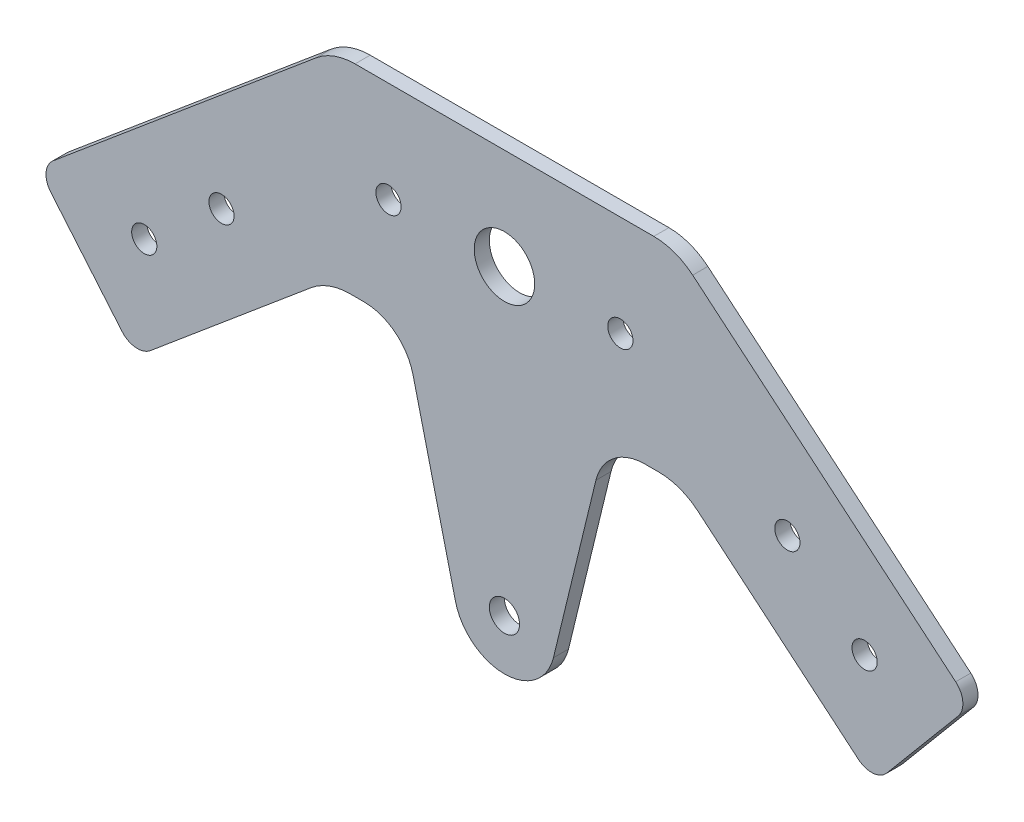
ISO-10303-21;
HEADER;
FILE_DESCRIPTION(('STEP AP214'),'2;1');
FILE_NAME('part.step','',(''),(''),'','','');
FILE_SCHEMA(('AUTOMOTIVE_DESIGN { 1 0 10303 214 1 1 1 1 }'));
ENDSEC;
DATA;
#1=APPLICATION_CONTEXT('core data for automotive mechanical design processes');
#2=APPLICATION_PROTOCOL_DEFINITION('international standard','automotive_design',2000,#1);
#3=PRODUCT_CONTEXT('',#1,'mechanical');
#4=PRODUCT('Part','Part','',(#3));
#5=PRODUCT_RELATED_PRODUCT_CATEGORY('part','',(#4));
#6=PRODUCT_DEFINITION_FORMATION('','',#4);
#7=PRODUCT_DEFINITION_CONTEXT('part definition',#1,'design');
#8=PRODUCT_DEFINITION('design','',#6,#7);
#9=PRODUCT_DEFINITION_SHAPE('','',#8);
#10=(LENGTH_UNIT() NAMED_UNIT(*) SI_UNIT(.MILLI.,.METRE.));
#11=(NAMED_UNIT(*) PLANE_ANGLE_UNIT() SI_UNIT($,.RADIAN.));
#12=(NAMED_UNIT(*) SI_UNIT($,.STERADIAN.) SOLID_ANGLE_UNIT());
#13=UNCERTAINTY_MEASURE_WITH_UNIT(LENGTH_MEASURE(1.E-05),#10,'distance_accuracy_value','');
#14=(GEOMETRIC_REPRESENTATION_CONTEXT(3) GLOBAL_UNCERTAINTY_ASSIGNED_CONTEXT((#13)) GLOBAL_UNIT_ASSIGNED_CONTEXT((#10,
#11,#12)) REPRESENTATION_CONTEXT('',''));
#15=CARTESIAN_POINT('',(0.,0.,0.));
#16=DIRECTION('',(0.,0.,1.));
#17=DIRECTION('',(1.,0.,0.));
#18=AXIS2_PLACEMENT_3D('',#15,#16,#17);
#19=CARTESIAN_POINT('',(27.862996478469,-9.99999999999998,-3.));
#20=DIRECTION('',(0.,0.,1.));
#21=DIRECTION('',(1.,0.,0.));
#22=AXIS2_PLACEMENT_3D('',#19,#20,#21);
#23=CYLINDRICAL_SURFACE('',#22,10.);
#24=CARTESIAN_POINT('',(27.862996478469,-9.99999999999998,0.));
#25=DIRECTION('',(0.,0.,-1.));
#26=DIRECTION('',(1.,0.,0.));
#27=AXIS2_PLACEMENT_3D('',#24,#25,#26);
#28=CIRCLE('',#27,10.);
#29=CARTESIAN_POINT('',(18.1451985913876,-7.64110105645935,0.));
#30=VERTEX_POINT('',#29);
#31=CARTESIAN_POINT('',(27.862996478469,0.,0.));
#32=VERTEX_POINT('',#31);
#33=EDGE_CURVE('E221',#30,#32,#28,.T.);
#34=ORIENTED_EDGE('',*,*,#33,.F.);
#35=DIRECTION('',(0.,0.,1.));
#36=VECTOR('',#35,1.);
#37=CARTESIAN_POINT('',(18.1451985913876,-7.64110105645935,-3.));
#38=LINE('',#37,#36);
#39=CARTESIAN_POINT('',(18.1451985913876,-7.64110105645935,-3.));
#40=VERTEX_POINT('',#39);
#41=EDGE_CURVE('E12',#40,#30,#38,.T.);
#42=ORIENTED_EDGE('',*,*,#41,.F.);
#43=CARTESIAN_POINT('',(27.862996478469,-9.99999999999998,-3.));
#44=DIRECTION('',(0.,0.,-1.));
#45=DIRECTION('',(1.,0.,0.));
#46=AXIS2_PLACEMENT_3D('',#43,#44,#45);
#47=CIRCLE('',#46,10.);
#48=CARTESIAN_POINT('',(27.862996478469,0.,-3.));
#49=VERTEX_POINT('',#48);
#50=EDGE_CURVE('E340',#40,#49,#47,.T.);
#51=ORIENTED_EDGE('',*,*,#50,.T.);
#52=DIRECTION('',(0.,0.,1.));
#53=VECTOR('',#52,1.);
#54=CARTESIAN_POINT('',(27.862996478469,0.,-3.));
#55=LINE('',#54,#53);
#56=EDGE_CURVE('E43',#49,#32,#55,.T.);
#57=ORIENTED_EDGE('',*,*,#56,.T.);
#58=EDGE_LOOP('',(#34,#42,#51,#57));
#59=FACE_BOUND('',#58,.T.);
#60=ADVANCED_FACE('F40',(#59),#23,.F.);
#61=CARTESIAN_POINT('',(18.1451985913876,-7.64110105645935,-3.));
#62=DIRECTION('',(0.971779788708134,-0.235889894354069,0.));
#63=DIRECTION('',(0.235889894354069,0.971779788708135,0.));
#64=AXIS2_PLACEMENT_3D('',#61,#62,#63);
#65=PLANE('',#64);
#66=DIRECTION('',(0.235889894354069,0.971779788708135,0.));
#67=VECTOR('',#66,1.);
#68=CARTESIAN_POINT('',(18.1451985913876,-7.64110105645935,0.));
#69=LINE('',#68,#67);
#70=CARTESIAN_POINT('',(9.71779788708135,-42.3588989435407,0.));
#71=VERTEX_POINT('',#70);
#72=EDGE_CURVE('E336',#71,#30,#69,.T.);
#73=ORIENTED_EDGE('',*,*,#72,.F.);
#74=DIRECTION('',(0.,0.,1.));
#75=VECTOR('',#74,1.);
#76=CARTESIAN_POINT('',(9.71779788708135,-42.3588989435407,-3.));
#77=LINE('',#76,#75);
#78=CARTESIAN_POINT('',(9.71779788708135,-42.3588989435407,-3.));
#79=VERTEX_POINT('',#78);
#80=EDGE_CURVE('E49',#79,#71,#77,.T.);
#81=ORIENTED_EDGE('',*,*,#80,.F.);
#82=DIRECTION('',(0.235889894354069,0.971779788708135,0.));
#83=VECTOR('',#82,1.);
#84=CARTESIAN_POINT('',(18.1451985913876,-7.64110105645935,-3.));
#85=LINE('',#84,#83);
#86=EDGE_CURVE('E211',#79,#40,#85,.T.);
#87=ORIENTED_EDGE('',*,*,#86,.T.);
#88=ORIENTED_EDGE('',*,*,#41,.T.);
#89=EDGE_LOOP('',(#73,#81,#87,#88));
#90=FACE_BOUND('',#89,.T.);
#91=ADVANCED_FACE('F383',(#90),#65,.T.);
#92=CARTESIAN_POINT('',(0.,-40.,-3.));
#93=DIRECTION('',(0.,0.,1.));
#94=DIRECTION('',(1.,0.,0.));
#95=AXIS2_PLACEMENT_3D('',#92,#93,#94);
#96=CYLINDRICAL_SURFACE('',#95,10.);
#97=CARTESIAN_POINT('',(0.,-40.,0.));
#98=DIRECTION('',(0.,0.,1.));
#99=DIRECTION('',(1.,0.,0.));
#100=AXIS2_PLACEMENT_3D('',#97,#98,#99);
#101=CIRCLE('',#100,10.);
#102=CARTESIAN_POINT('',(-9.71779788708135,-42.3588989435407,0.));
#103=VERTEX_POINT('',#102);
#104=EDGE_CURVE('E198',#103,#71,#101,.T.);
#105=ORIENTED_EDGE('',*,*,#104,.F.);
#106=DIRECTION('',(0.,0.,1.));
#107=VECTOR('',#106,1.);
#108=CARTESIAN_POINT('',(-9.71779788708135,-42.3588989435407,-3.));
#109=LINE('',#108,#107);
#110=CARTESIAN_POINT('',(-9.71779788708135,-42.3588989435407,-3.));
#111=VERTEX_POINT('',#110);
#112=EDGE_CURVE('E193',#111,#103,#109,.T.);
#113=ORIENTED_EDGE('',*,*,#112,.F.);
#114=CARTESIAN_POINT('',(0.,-40.,-3.));
#115=DIRECTION('',(0.,0.,1.));
#116=DIRECTION('',(1.,0.,0.));
#117=AXIS2_PLACEMENT_3D('',#114,#115,#116);
#118=CIRCLE('',#117,10.);
#119=EDGE_CURVE('E196',#111,#79,#118,.T.);
#120=ORIENTED_EDGE('',*,*,#119,.T.);
#121=ORIENTED_EDGE('',*,*,#80,.T.);
#122=EDGE_LOOP('',(#105,#113,#120,#121));
#123=FACE_BOUND('',#122,.T.);
#124=ADVANCED_FACE('F195',(#123),#96,.T.);
#125=CARTESIAN_POINT('',(-18.1451985913876,-7.64110105645937,-3.));
#126=DIRECTION('',(-0.971779788708135,-0.235889894354068,0.));
#127=DIRECTION('',(0.235889894354068,-0.971779788708135,0.));
#128=AXIS2_PLACEMENT_3D('',#125,#126,#127);
#129=PLANE('',#128);
#130=DIRECTION('',(0.235889894354068,-0.971779788708135,0.));
#131=VECTOR('',#130,1.);
#132=CARTESIAN_POINT('',(-18.1451985913876,-7.64110105645937,0.));
#133=LINE('',#132,#131);
#134=CARTESIAN_POINT('',(-18.1451985913876,-7.64110105645937,0.));
#135=VERTEX_POINT('',#134);
#136=EDGE_CURVE('E330',#135,#103,#133,.T.);
#137=ORIENTED_EDGE('',*,*,#136,.F.);
#138=DIRECTION('',(0.,0.,1.));
#139=VECTOR('',#138,1.);
#140=CARTESIAN_POINT('',(-18.1451985913876,-7.64110105645937,-3.));
#141=LINE('',#140,#139);
#142=CARTESIAN_POINT('',(-18.1451985913876,-7.64110105645937,-3.));
#143=VERTEX_POINT('',#142);
#144=EDGE_CURVE('E203',#143,#135,#141,.T.);
#145=ORIENTED_EDGE('',*,*,#144,.F.);
#146=DIRECTION('',(0.235889894354068,-0.971779788708135,0.));
#147=VECTOR('',#146,1.);
#148=CARTESIAN_POINT('',(-18.1451985913876,-7.64110105645937,-3.));
#149=LINE('',#148,#147);
#150=EDGE_CURVE('E209',#143,#111,#149,.T.);
#151=ORIENTED_EDGE('',*,*,#150,.T.);
#152=ORIENTED_EDGE('',*,*,#112,.T.);
#153=EDGE_LOOP('',(#137,#145,#151,#152));
#154=FACE_BOUND('',#153,.T.);
#155=ADVANCED_FACE('F213',(#154),#129,.T.);
#156=CARTESIAN_POINT('',(-27.862996478469,-10.,-3.));
#157=DIRECTION('',(0.,0.,1.));
#158=DIRECTION('',(1.,0.,0.));
#159=AXIS2_PLACEMENT_3D('',#156,#157,#158);
#160=CYLINDRICAL_SURFACE('',#159,10.);
#161=CARTESIAN_POINT('',(-27.862996478469,-10.,0.));
#162=DIRECTION('',(0.,0.,-1.));
#163=DIRECTION('',(1.,0.,0.));
#164=AXIS2_PLACEMENT_3D('',#161,#162,#163);
#165=CIRCLE('',#164,10.);
#166=CARTESIAN_POINT('',(-27.862996478469,0.,0.));
#167=VERTEX_POINT('',#166);
#168=EDGE_CURVE('E326',#167,#135,#165,.T.);
#169=ORIENTED_EDGE('',*,*,#168,.F.);
#170=DIRECTION('',(0.,0.,1.));
#171=VECTOR('',#170,1.);
#172=CARTESIAN_POINT('',(-27.862996478469,0.,-3.));
#173=LINE('',#172,#171);
#174=CARTESIAN_POINT('',(-27.862996478469,0.,-3.));
#175=VERTEX_POINT('',#174);
#176=EDGE_CURVE('E344',#175,#167,#173,.T.);
#177=ORIENTED_EDGE('',*,*,#176,.F.);
#178=CARTESIAN_POINT('',(-27.862996478469,-10.,-3.));
#179=DIRECTION('',(0.,0.,-1.));
#180=DIRECTION('',(1.,0.,0.));
#181=AXIS2_PLACEMENT_3D('',#178,#179,#180);
#182=CIRCLE('',#181,10.);
#183=EDGE_CURVE('E214',#175,#143,#182,.T.);
#184=ORIENTED_EDGE('',*,*,#183,.T.);
#185=ORIENTED_EDGE('',*,*,#144,.T.);
#186=EDGE_LOOP('',(#169,#177,#184,#185));
#187=FACE_BOUND('',#186,.T.);
#188=ADVANCED_FACE('F396',(#187),#160,.F.);
#189=CARTESIAN_POINT('',(-30.6323571888055,0.,-3.));
#190=DIRECTION('',(0.,-1.,0.));
#191=DIRECTION('',(1.,0.,0.));
#192=AXIS2_PLACEMENT_3D('',#189,#190,#191);
#193=PLANE('',#192);
#194=DIRECTION('',(1.,0.,0.));
#195=VECTOR('',#194,1.);
#196=CARTESIAN_POINT('',(-30.6323571888055,0.,0.));
#197=LINE('',#196,#195);
#198=CARTESIAN_POINT('',(-30.6323571888055,0.,0.));
#199=VERTEX_POINT('',#198);
#200=EDGE_CURVE('E319',#199,#167,#197,.T.);
#201=ORIENTED_EDGE('',*,*,#200,.F.);
#202=DIRECTION('',(0.,0.,1.));
#203=VECTOR('',#202,1.);
#204=CARTESIAN_POINT('',(-30.6323571888055,0.,-3.));
#205=LINE('',#204,#203);
#206=CARTESIAN_POINT('',(-30.6323571888055,0.,-3.));
#207=VERTEX_POINT('',#206);
#208=EDGE_CURVE('E346',#207,#199,#205,.T.);
#209=ORIENTED_EDGE('',*,*,#208,.F.);
#210=DIRECTION('',(1.,0.,0.));
#211=VECTOR('',#210,1.);
#212=CARTESIAN_POINT('',(-30.6323571888055,0.,-3.));
#213=LINE('',#212,#211);
#214=EDGE_CURVE('E216',#207,#175,#213,.T.);
#215=ORIENTED_EDGE('',*,*,#214,.T.);
#216=ORIENTED_EDGE('',*,*,#176,.T.);
#217=EDGE_LOOP('',(#201,#209,#215,#216));
#218=FACE_BOUND('',#217,.T.);
#219=ADVANCED_FACE('F399',(#218),#193,.T.);
#220=CARTESIAN_POINT('',(-30.6323571888055,-12.,-3.));
#221=DIRECTION('',(0.,0.,1.));
#222=DIRECTION('',(1.,0.,0.));
#223=AXIS2_PLACEMENT_3D('',#220,#221,#222);
#224=CYLINDRICAL_SURFACE('',#223,12.);
#225=CARTESIAN_POINT('',(-30.6323571888055,-12.,0.));
#226=DIRECTION('',(0.,0.,-1.));
#227=DIRECTION('',(1.,0.,0.));
#228=AXIS2_PLACEMENT_3D('',#225,#226,#227);
#229=CIRCLE('',#228,12.);
#230=CARTESIAN_POINT('',(-38.345808505044,-2.80746668257224,0.));
#231=VERTEX_POINT('',#230);
#232=EDGE_CURVE('E314',#231,#199,#229,.T.);
#233=ORIENTED_EDGE('',*,*,#232,.F.);
#234=DIRECTION('',(0.,0.,1.));
#235=VECTOR('',#234,1.);
#236=CARTESIAN_POINT('',(-38.345808505044,-2.80746668257224,-3.));
#237=LINE('',#236,#235);
#238=CARTESIAN_POINT('',(-38.345808505044,-2.80746668257224,-3.));
#239=VERTEX_POINT('',#238);
#240=EDGE_CURVE('E348',#239,#231,#237,.T.);
#241=ORIENTED_EDGE('',*,*,#240,.F.);
#242=CARTESIAN_POINT('',(-30.6323571888055,-12.,-3.));
#243=DIRECTION('',(0.,0.,-1.));
#244=DIRECTION('',(1.,0.,0.));
#245=AXIS2_PLACEMENT_3D('',#242,#243,#244);
#246=CIRCLE('',#245,12.);
#247=EDGE_CURVE('E621',#239,#207,#246,.T.);
#248=ORIENTED_EDGE('',*,*,#247,.T.);
#249=ORIENTED_EDGE('',*,*,#208,.T.);
#250=EDGE_LOOP('',(#233,#241,#248,#249));
#251=FACE_BOUND('',#250,.T.);
#252=ADVANCED_FACE('F403',(#251),#224,.F.);
#253=CARTESIAN_POINT('',(-38.345808505044,-2.80746668257224,-3.));
#254=DIRECTION('',(0.642787609686538,-0.766044443118979,0.));
#255=DIRECTION('',(0.766044443118979,0.642787609686538,0.));
#256=AXIS2_PLACEMENT_3D('',#253,#254,#255);
#257=PLANE('',#256);
#258=DIRECTION('',(0.766044443118979,0.642787609686538,0.));
#259=VECTOR('',#258,1.);
#260=CARTESIAN_POINT('',(-38.345808505044,-2.80746668257224,0.));
#261=LINE('',#260,#259);
#262=CARTESIAN_POINT('',(-70.238044383473,-29.5682300455807,0.));
#263=VERTEX_POINT('',#262);
#264=EDGE_CURVE('E309',#263,#231,#261,.T.);
#265=ORIENTED_EDGE('',*,*,#264,.F.);
#266=DIRECTION('',(0.,0.,1.));
#267=VECTOR('',#266,1.);
#268=CARTESIAN_POINT('',(-70.238044383473,-29.5682300455807,-3.));
#269=LINE('',#268,#267);
#270=CARTESIAN_POINT('',(-70.238044383473,-29.5682300455807,-3.));
#271=VERTEX_POINT('',#270);
#272=EDGE_CURVE('E350',#271,#263,#269,.T.);
#273=ORIENTED_EDGE('',*,*,#272,.F.);
#274=DIRECTION('',(0.766044443118979,0.642787609686538,0.));
#275=VECTOR('',#274,1.);
#276=CARTESIAN_POINT('',(-38.345808505044,-2.80746668257224,-3.));
#277=LINE('',#276,#275);
#278=EDGE_CURVE('E618',#271,#239,#277,.T.);
#279=ORIENTED_EDGE('',*,*,#278,.T.);
#280=ORIENTED_EDGE('',*,*,#240,.T.);
#281=EDGE_LOOP('',(#265,#273,#279,#280));
#282=FACE_BOUND('',#281,.T.);
#283=ADVANCED_FACE('F407',(#282),#257,.T.);
#284=CARTESIAN_POINT('',(-72.8091948222192,-26.5040522731048,-3.));
#285=DIRECTION('',(0.,0.,1.));
#286=DIRECTION('',(1.,0.,0.));
#287=AXIS2_PLACEMENT_3D('',#284,#285,#286);
#288=CYLINDRICAL_SURFACE('',#287,4.);
#289=CARTESIAN_POINT('',(-72.8091948222192,-26.5040522731048,0.));
#290=DIRECTION('',(0.,0.,1.));
#291=DIRECTION('',(-1.,0.,0.));
#292=AXIS2_PLACEMENT_3D('',#289,#290,#291);
#293=CIRCLE('',#292,4.);
#294=CARTESIAN_POINT('',(-75.8733725946951,-29.075202711851,0.));
#295=VERTEX_POINT('',#294);
#296=EDGE_CURVE('E305',#295,#263,#293,.T.);
#297=ORIENTED_EDGE('',*,*,#296,.F.);
#298=DIRECTION('',(0.,0.,1.));
#299=VECTOR('',#298,1.);
#300=CARTESIAN_POINT('',(-75.8733725946951,-29.075202711851,-3.));
#301=LINE('',#300,#299);
#302=CARTESIAN_POINT('',(-75.8733725946951,-29.075202711851,-3.));
#303=VERTEX_POINT('',#302);
#304=EDGE_CURVE('E352',#303,#295,#301,.T.);
#305=ORIENTED_EDGE('',*,*,#304,.F.);
#306=CARTESIAN_POINT('',(-72.8091948222192,-26.5040522731048,-3.));
#307=DIRECTION('',(0.,0.,1.));
#308=DIRECTION('',(-1.,0.,0.));
#309=AXIS2_PLACEMENT_3D('',#306,#307,#308);
#310=CIRCLE('',#309,4.);
#311=EDGE_CURVE('E615',#303,#271,#310,.T.);
#312=ORIENTED_EDGE('',*,*,#311,.T.);
#313=ORIENTED_EDGE('',*,*,#272,.T.);
#314=EDGE_LOOP('',(#297,#305,#312,#313));
#315=FACE_BOUND('',#314,.T.);
#316=ADVANCED_FACE('F411',(#315),#288,.T.);
#317=CARTESIAN_POINT('',(-75.8733725946951,-29.075202711851,-3.));
#318=DIRECTION('',(-0.766044443118979,-0.642787609686538,0.));
#319=DIRECTION('',(0.642787609686538,-0.766044443118979,0.));
#320=AXIS2_PLACEMENT_3D('',#317,#318,#319);
#321=PLANE('',#320);
#322=DIRECTION('',(0.642787609686538,-0.766044443118979,0.));
#323=VECTOR('',#322,1.);
#324=CARTESIAN_POINT('',(-75.8733725946951,-29.075202711851,0.));
#325=LINE('',#324,#323);
#326=CARTESIAN_POINT('',(-90.0147000077989,-12.2222249632334,0.));
#327=VERTEX_POINT('',#326);
#328=EDGE_CURVE('E297',#327,#295,#325,.T.);
#329=ORIENTED_EDGE('',*,*,#328,.F.);
#330=DIRECTION('',(0.,0.,1.));
#331=VECTOR('',#330,1.);
#332=CARTESIAN_POINT('',(-90.0147000077989,-12.2222249632334,-3.));
#333=LINE('',#332,#331);
#334=CARTESIAN_POINT('',(-90.0147000077989,-12.2222249632334,-3.));
#335=VERTEX_POINT('',#334);
#336=EDGE_CURVE('E354',#335,#327,#333,.T.);
#337=ORIENTED_EDGE('',*,*,#336,.F.);
#338=DIRECTION('',(0.642787609686538,-0.766044443118979,0.));
#339=VECTOR('',#338,1.);
#340=CARTESIAN_POINT('',(-75.8733725946951,-29.075202711851,-3.));
#341=LINE('',#340,#339);
#342=EDGE_CURVE('E612',#335,#303,#341,.T.);
#343=ORIENTED_EDGE('',*,*,#342,.T.);
#344=ORIENTED_EDGE('',*,*,#304,.T.);
#345=EDGE_LOOP('',(#329,#337,#343,#344));
#346=FACE_BOUND('',#345,.T.);
#347=ADVANCED_FACE('F415',(#346),#321,.T.);
#348=CARTESIAN_POINT('',(-86.950522235323,-9.65107452448727,-3.));
#349=DIRECTION('',(0.,0.,1.));
#350=DIRECTION('',(1.,0.,0.));
#351=AXIS2_PLACEMENT_3D('',#348,#349,#350);
#352=CYLINDRICAL_SURFACE('',#351,3.99999999999999);
#353=CARTESIAN_POINT('',(-86.950522235323,-9.65107452448727,0.));
#354=DIRECTION('',(0.,0.,1.));
#355=DIRECTION('',(1.,0.,0.));
#356=AXIS2_PLACEMENT_3D('',#353,#354,#355);
#357=CIRCLE('',#356,3.99999999999999);
#358=CARTESIAN_POINT('',(-89.5216726740692,-6.58689675201136,0.));
#359=VERTEX_POINT('',#358);
#360=EDGE_CURVE('E292',#359,#327,#357,.T.);
#361=ORIENTED_EDGE('',*,*,#360,.F.);
#362=DIRECTION('',(0.,0.,1.));
#363=VECTOR('',#362,1.);
#364=CARTESIAN_POINT('',(-89.5216726740692,-6.58689675201136,-3.));
#365=LINE('',#364,#363);
#366=CARTESIAN_POINT('',(-89.5216726740692,-6.58689675201136,-3.));
#367=VERTEX_POINT('',#366);
#368=EDGE_CURVE('E356',#367,#359,#365,.T.);
#369=ORIENTED_EDGE('',*,*,#368,.F.);
#370=CARTESIAN_POINT('',(-86.950522235323,-9.65107452448727,-3.));
#371=DIRECTION('',(0.,0.,1.));
#372=DIRECTION('',(1.,0.,0.));
#373=AXIS2_PLACEMENT_3D('',#370,#371,#372);
#374=CIRCLE('',#373,3.99999999999999);
#375=EDGE_CURVE('E609',#367,#335,#374,.T.);
#376=ORIENTED_EDGE('',*,*,#375,.T.);
#377=ORIENTED_EDGE('',*,*,#336,.T.);
#378=EDGE_LOOP('',(#361,#369,#376,#377));
#379=FACE_BOUND('',#378,.T.);
#380=ADVANCED_FACE('F419',(#379),#352,.T.);
#381=CARTESIAN_POINT('',(-89.5216726740692,-6.58689675201136,-3.));
#382=DIRECTION('',(-0.642787609686538,0.766044443118979,0.));
#383=DIRECTION('',(-0.766044443118979,-0.642787609686538,0.));
#384=AXIS2_PLACEMENT_3D('',#381,#382,#383);
#385=PLANE('',#384);
#386=DIRECTION('',(-0.766044443118979,-0.642787609686538,0.));
#387=VECTOR('',#386,1.);
#388=CARTESIAN_POINT('',(-89.5216726740692,-6.58689675201136,0.));
#389=LINE('',#388,#387);
#390=CARTESIAN_POINT('',(-37.3473796070879,37.1925333174278,0.));
#391=VERTEX_POINT('',#390);
#392=EDGE_CURVE('E287',#391,#359,#389,.T.);
#393=ORIENTED_EDGE('',*,*,#392,.F.);
#394=DIRECTION('',(0.,0.,1.));
#395=VECTOR('',#394,1.);
#396=CARTESIAN_POINT('',(-37.3473796070879,37.1925333174278,-3.));
#397=LINE('',#396,#395);
#398=CARTESIAN_POINT('',(-37.3473796070879,37.1925333174278,-3.));
#399=VERTEX_POINT('',#398);
#400=EDGE_CURVE('E358',#399,#391,#397,.T.);
#401=ORIENTED_EDGE('',*,*,#400,.F.);
#402=DIRECTION('',(-0.766044443118979,-0.642787609686538,0.));
#403=VECTOR('',#402,1.);
#404=CARTESIAN_POINT('',(-89.5216726740692,-6.58689675201136,-3.));
#405=LINE('',#404,#403);
#406=EDGE_CURVE('E606',#399,#367,#405,.T.);
#407=ORIENTED_EDGE('',*,*,#406,.T.);
#408=ORIENTED_EDGE('',*,*,#368,.T.);
#409=EDGE_LOOP('',(#393,#401,#407,#408));
#410=FACE_BOUND('',#409,.T.);
#411=ADVANCED_FACE('F423',(#410),#385,.T.);
#412=CARTESIAN_POINT('',(-29.6339282908495,28.,-3.));
#413=DIRECTION('',(0.,0.,1.));
#414=DIRECTION('',(1.,0.,0.));
#415=AXIS2_PLACEMENT_3D('',#412,#413,#414);
#416=CYLINDRICAL_SURFACE('',#415,12.);
#417=CARTESIAN_POINT('',(-29.6339282908495,28.,0.));
#418=DIRECTION('',(0.,0.,1.));
#419=DIRECTION('',(-1.,0.,0.));
#420=AXIS2_PLACEMENT_3D('',#417,#418,#419);
#421=CIRCLE('',#420,12.);
#422=CARTESIAN_POINT('',(-29.6339282908495,40.,0.));
#423=VERTEX_POINT('',#422);
#424=EDGE_CURVE('E283',#423,#391,#421,.T.);
#425=ORIENTED_EDGE('',*,*,#424,.F.);
#426=DIRECTION('',(0.,0.,1.));
#427=VECTOR('',#426,1.);
#428=CARTESIAN_POINT('',(-29.6339282908495,40.,-3.));
#429=LINE('',#428,#427);
#430=CARTESIAN_POINT('',(-29.6339282908495,40.,-3.));
#431=VERTEX_POINT('',#430);
#432=EDGE_CURVE('E360',#431,#423,#429,.T.);
#433=ORIENTED_EDGE('',*,*,#432,.F.);
#434=CARTESIAN_POINT('',(-29.6339282908495,28.,-3.));
#435=DIRECTION('',(0.,0.,1.));
#436=DIRECTION('',(-1.,0.,0.));
#437=AXIS2_PLACEMENT_3D('',#434,#435,#436);
#438=CIRCLE('',#437,12.);
#439=EDGE_CURVE('E603',#431,#399,#438,.T.);
#440=ORIENTED_EDGE('',*,*,#439,.T.);
#441=ORIENTED_EDGE('',*,*,#400,.T.);
#442=EDGE_LOOP('',(#425,#433,#440,#441));
#443=FACE_BOUND('',#442,.T.);
#444=ADVANCED_FACE('F427',(#443),#416,.T.);
#445=CARTESIAN_POINT('',(-29.6339282908495,40.,-3.));
#446=DIRECTION('',(0.,1.,0.));
#447=DIRECTION('',(-1.,0.,0.));
#448=AXIS2_PLACEMENT_3D('',#445,#446,#447);
#449=PLANE('',#448);
#450=DIRECTION('',(-1.,0.,0.));
#451=VECTOR('',#450,1.);
#452=CARTESIAN_POINT('',(-29.6339282908495,40.,0.));
#453=LINE('',#452,#451);
#454=CARTESIAN_POINT('',(29.6339282908495,40.,0.));
#455=VERTEX_POINT('',#454);
#456=EDGE_CURVE('E275',#455,#423,#453,.T.);
#457=ORIENTED_EDGE('',*,*,#456,.F.);
#458=DIRECTION('',(0.,0.,1.));
#459=VECTOR('',#458,1.);
#460=CARTESIAN_POINT('',(29.6339282908495,40.,-3.));
#461=LINE('',#460,#459);
#462=CARTESIAN_POINT('',(29.6339282908495,40.,-3.));
#463=VERTEX_POINT('',#462);
#464=EDGE_CURVE('E362',#463,#455,#461,.T.);
#465=ORIENTED_EDGE('',*,*,#464,.F.);
#466=DIRECTION('',(-1.,0.,0.));
#467=VECTOR('',#466,1.);
#468=CARTESIAN_POINT('',(29.6339282908495,40.,-3.));
#469=LINE('',#468,#467);
#470=EDGE_CURVE('E601',#463,#431,#469,.T.);
#471=ORIENTED_EDGE('',*,*,#470,.T.);
#472=ORIENTED_EDGE('',*,*,#432,.T.);
#473=EDGE_LOOP('',(#457,#465,#471,#472));
#474=FACE_BOUND('',#473,.T.);
#475=ADVANCED_FACE('F431',(#474),#449,.T.);
#476=CARTESIAN_POINT('',(29.6339282908495,28.,-3.));
#477=DIRECTION('',(0.,0.,1.));
#478=DIRECTION('',(1.,0.,0.));
#479=AXIS2_PLACEMENT_3D('',#476,#477,#478);
#480=CYLINDRICAL_SURFACE('',#479,12.);
#481=CARTESIAN_POINT('',(29.6339282908495,28.,0.));
#482=DIRECTION('',(0.,0.,1.));
#483=DIRECTION('',(1.,0.,0.));
#484=AXIS2_PLACEMENT_3D('',#481,#482,#483);
#485=CIRCLE('',#484,12.);
#486=CARTESIAN_POINT('',(37.3473796070879,37.1925333174278,0.));
#487=VERTEX_POINT('',#486);
#488=EDGE_CURVE('E270',#487,#455,#485,.T.);
#489=ORIENTED_EDGE('',*,*,#488,.F.);
#490=DIRECTION('',(0.,0.,1.));
#491=VECTOR('',#490,1.);
#492=CARTESIAN_POINT('',(37.3473796070879,37.1925333174278,-3.));
#493=LINE('',#492,#491);
#494=CARTESIAN_POINT('',(37.3473796070879,37.1925333174278,-3.));
#495=VERTEX_POINT('',#494);
#496=EDGE_CURVE('E365',#495,#487,#493,.T.);
#497=ORIENTED_EDGE('',*,*,#496,.F.);
#498=CARTESIAN_POINT('',(29.6339282908495,28.,-3.));
#499=DIRECTION('',(0.,0.,1.));
#500=DIRECTION('',(1.,0.,0.));
#501=AXIS2_PLACEMENT_3D('',#498,#499,#500);
#502=CIRCLE('',#501,12.);
#503=EDGE_CURVE('E598',#495,#463,#502,.T.);
#504=ORIENTED_EDGE('',*,*,#503,.T.);
#505=ORIENTED_EDGE('',*,*,#464,.T.);
#506=EDGE_LOOP('',(#489,#497,#504,#505));
#507=FACE_BOUND('',#506,.T.);
#508=ADVANCED_FACE('F435',(#507),#480,.T.);
#509=CARTESIAN_POINT('',(89.5216726740692,-6.58689675201139,-3.));
#510=DIRECTION('',(0.642787609686538,0.766044443118979,0.));
#511=DIRECTION('',(-0.766044443118979,0.642787609686538,0.));
#512=AXIS2_PLACEMENT_3D('',#509,#510,#511);
#513=PLANE('',#512);
#514=DIRECTION('',(-0.766044443118979,0.642787609686538,0.));
#515=VECTOR('',#514,1.);
#516=CARTESIAN_POINT('',(89.5216726740692,-6.58689675201139,0.));
#517=LINE('',#516,#515);
#518=CARTESIAN_POINT('',(89.5216726740692,-6.58689675201138,0.));
#519=VERTEX_POINT('',#518);
#520=EDGE_CURVE('E265',#519,#487,#517,.T.);
#521=ORIENTED_EDGE('',*,*,#520,.F.);
#522=DIRECTION('',(0.,0.,1.));
#523=VECTOR('',#522,1.);
#524=CARTESIAN_POINT('',(89.5216726740692,-6.58689675201138,-3.));
#525=LINE('',#524,#523);
#526=CARTESIAN_POINT('',(89.5216726740692,-6.58689675201138,-3.));
#527=VERTEX_POINT('',#526);
#528=EDGE_CURVE('E367',#527,#519,#525,.T.);
#529=ORIENTED_EDGE('',*,*,#528,.F.);
#530=DIRECTION('',(-0.766044443118979,0.642787609686538,0.));
#531=VECTOR('',#530,1.);
#532=CARTESIAN_POINT('',(89.5216726740692,-6.58689675201139,-3.));
#533=LINE('',#532,#531);
#534=EDGE_CURVE('E595',#527,#495,#533,.T.);
#535=ORIENTED_EDGE('',*,*,#534,.T.);
#536=ORIENTED_EDGE('',*,*,#496,.T.);
#537=EDGE_LOOP('',(#521,#529,#535,#536));
#538=FACE_BOUND('',#537,.T.);
#539=ADVANCED_FACE('F439',(#538),#513,.T.);
#540=CARTESIAN_POINT('',(86.950522235323,-9.65107452448731,-3.));
#541=DIRECTION('',(0.,0.,1.));
#542=DIRECTION('',(1.,0.,0.));
#543=AXIS2_PLACEMENT_3D('',#540,#541,#542);
#544=CYLINDRICAL_SURFACE('',#543,4.00000000000001);
#545=CARTESIAN_POINT('',(86.950522235323,-9.65107452448731,0.));
#546=DIRECTION('',(0.,0.,1.));
#547=DIRECTION('',(-1.,0.,0.));
#548=AXIS2_PLACEMENT_3D('',#545,#546,#547);
#549=CIRCLE('',#548,4.00000000000001);
#550=CARTESIAN_POINT('',(90.014700007799,-12.2222249632335,0.));
#551=VERTEX_POINT('',#550);
#552=EDGE_CURVE('E261',#551,#519,#549,.T.);
#553=ORIENTED_EDGE('',*,*,#552,.F.);
#554=DIRECTION('',(0.,0.,1.));
#555=VECTOR('',#554,1.);
#556=CARTESIAN_POINT('',(90.014700007799,-12.2222249632335,-3.));
#557=LINE('',#556,#555);
#558=CARTESIAN_POINT('',(90.014700007799,-12.2222249632335,-3.));
#559=VERTEX_POINT('',#558);
#560=EDGE_CURVE('E369',#559,#551,#557,.T.);
#561=ORIENTED_EDGE('',*,*,#560,.F.);
#562=CARTESIAN_POINT('',(86.950522235323,-9.65107452448731,-3.));
#563=DIRECTION('',(0.,0.,1.));
#564=DIRECTION('',(-1.,0.,0.));
#565=AXIS2_PLACEMENT_3D('',#562,#563,#564);
#566=CIRCLE('',#565,4.00000000000001);
#567=EDGE_CURVE('E592',#559,#527,#566,.T.);
#568=ORIENTED_EDGE('',*,*,#567,.T.);
#569=ORIENTED_EDGE('',*,*,#528,.T.);
#570=EDGE_LOOP('',(#553,#561,#568,#569));
#571=FACE_BOUND('',#570,.T.);
#572=ADVANCED_FACE('F443',(#571),#544,.T.);
#573=CARTESIAN_POINT('',(90.014700007799,-12.2222249632335,-3.));
#574=DIRECTION('',(0.766044443118979,-0.642787609686538,0.));
#575=DIRECTION('',(0.642787609686538,0.766044443118979,0.));
#576=AXIS2_PLACEMENT_3D('',#573,#574,#575);
#577=PLANE('',#576);
#578=DIRECTION('',(0.642787609686538,0.766044443118979,0.));
#579=VECTOR('',#578,1.);
#580=CARTESIAN_POINT('',(90.014700007799,-12.2222249632335,0.));
#581=LINE('',#580,#579);
#582=CARTESIAN_POINT('',(75.8733725946952,-29.0752027118509,0.));
#583=VERTEX_POINT('',#582);
#584=EDGE_CURVE('E253',#583,#551,#581,.T.);
#585=ORIENTED_EDGE('',*,*,#584,.F.);
#586=DIRECTION('',(0.,0.,1.));
#587=VECTOR('',#586,1.);
#588=CARTESIAN_POINT('',(75.8733725946952,-29.0752027118509,-3.));
#589=LINE('',#588,#587);
#590=CARTESIAN_POINT('',(75.8733725946952,-29.0752027118509,-3.));
#591=VERTEX_POINT('',#590);
#592=EDGE_CURVE('E371',#591,#583,#589,.T.);
#593=ORIENTED_EDGE('',*,*,#592,.F.);
#594=DIRECTION('',(0.642787609686538,0.766044443118979,0.));
#595=VECTOR('',#594,1.);
#596=CARTESIAN_POINT('',(90.014700007799,-12.2222249632335,-3.));
#597=LINE('',#596,#595);
#598=EDGE_CURVE('E589',#591,#559,#597,.T.);
#599=ORIENTED_EDGE('',*,*,#598,.T.);
#600=ORIENTED_EDGE('',*,*,#560,.T.);
#601=EDGE_LOOP('',(#585,#593,#599,#600));
#602=FACE_BOUND('',#601,.T.);
#603=ADVANCED_FACE('F447',(#602),#577,.T.);
#604=CARTESIAN_POINT('',(72.8091948222193,-26.5040522731048,-3.));
#605=DIRECTION('',(0.,0.,1.));
#606=DIRECTION('',(1.,0.,0.));
#607=AXIS2_PLACEMENT_3D('',#604,#605,#606);
#608=CYLINDRICAL_SURFACE('',#607,4.);
#609=CARTESIAN_POINT('',(72.8091948222193,-26.5040522731048,0.));
#610=DIRECTION('',(0.,0.,1.));
#611=DIRECTION('',(-1.,0.,0.));
#612=AXIS2_PLACEMENT_3D('',#609,#610,#611);
#613=CIRCLE('',#612,4.);
#614=CARTESIAN_POINT('',(70.2380443834731,-29.5682300455807,0.));
#615=VERTEX_POINT('',#614);
#616=EDGE_CURVE('E248',#615,#583,#613,.T.);
#617=ORIENTED_EDGE('',*,*,#616,.F.);
#618=DIRECTION('',(0.,0.,1.));
#619=VECTOR('',#618,1.);
#620=CARTESIAN_POINT('',(70.2380443834731,-29.5682300455807,-3.));
#621=LINE('',#620,#619);
#622=CARTESIAN_POINT('',(70.2380443834731,-29.5682300455807,-3.));
#623=VERTEX_POINT('',#622);
#624=EDGE_CURVE('E373',#623,#615,#621,.T.);
#625=ORIENTED_EDGE('',*,*,#624,.F.);
#626=CARTESIAN_POINT('',(72.8091948222193,-26.5040522731048,-3.));
#627=DIRECTION('',(0.,0.,1.));
#628=DIRECTION('',(-1.,0.,0.));
#629=AXIS2_PLACEMENT_3D('',#626,#627,#628);
#630=CIRCLE('',#629,4.);
#631=EDGE_CURVE('E586',#623,#591,#630,.T.);
#632=ORIENTED_EDGE('',*,*,#631,.T.);
#633=ORIENTED_EDGE('',*,*,#592,.T.);
#634=EDGE_LOOP('',(#617,#625,#632,#633));
#635=FACE_BOUND('',#634,.T.);
#636=ADVANCED_FACE('F451',(#635),#608,.T.);
#637=CARTESIAN_POINT('',(70.2380443834731,-29.5682300455807,-3.));
#638=DIRECTION('',(-0.642787609686537,-0.76604444311898,0.));
#639=DIRECTION('',(0.76604444311898,-0.642787609686537,0.));
#640=AXIS2_PLACEMENT_3D('',#637,#638,#639);
#641=PLANE('',#640);
#642=DIRECTION('',(0.76604444311898,-0.642787609686537,0.));
#643=VECTOR('',#642,1.);
#644=CARTESIAN_POINT('',(70.2380443834731,-29.5682300455807,0.));
#645=LINE('',#644,#643);
#646=CARTESIAN_POINT('',(38.3458085050441,-2.80746668257222,0.));
#647=VERTEX_POINT('',#646);
#648=EDGE_CURVE('E243',#647,#615,#645,.T.);
#649=ORIENTED_EDGE('',*,*,#648,.F.);
#650=DIRECTION('',(0.,0.,1.));
#651=VECTOR('',#650,1.);
#652=CARTESIAN_POINT('',(38.3458085050441,-2.80746668257222,-3.));
#653=LINE('',#652,#651);
#654=CARTESIAN_POINT('',(38.3458085050441,-2.80746668257222,-3.));
#655=VERTEX_POINT('',#654);
#656=EDGE_CURVE('E375',#655,#647,#653,.T.);
#657=ORIENTED_EDGE('',*,*,#656,.F.);
#658=DIRECTION('',(0.76604444311898,-0.642787609686537,0.));
#659=VECTOR('',#658,1.);
#660=CARTESIAN_POINT('',(70.2380443834731,-29.5682300455807,-3.));
#661=LINE('',#660,#659);
#662=EDGE_CURVE('E583',#655,#623,#661,.T.);
#663=ORIENTED_EDGE('',*,*,#662,.T.);
#664=ORIENTED_EDGE('',*,*,#624,.T.);
#665=EDGE_LOOP('',(#649,#657,#663,#664));
#666=FACE_BOUND('',#665,.T.);
#667=ADVANCED_FACE('F455',(#666),#641,.T.);
#668=CARTESIAN_POINT('',(30.6323571888057,-12.,-3.));
#669=DIRECTION('',(0.,0.,1.));
#670=DIRECTION('',(1.,0.,0.));
#671=AXIS2_PLACEMENT_3D('',#668,#669,#670);
#672=CYLINDRICAL_SURFACE('',#671,12.);
#673=CARTESIAN_POINT('',(30.6323571888057,-12.,0.));
#674=DIRECTION('',(0.,0.,-1.));
#675=DIRECTION('',(1.,0.,0.));
#676=AXIS2_PLACEMENT_3D('',#673,#674,#675);
#677=CIRCLE('',#676,12.);
#678=CARTESIAN_POINT('',(30.6323571888057,0.,0.));
#679=VERTEX_POINT('',#678);
#680=EDGE_CURVE('E239',#679,#647,#677,.T.);
#681=ORIENTED_EDGE('',*,*,#680,.F.);
#682=DIRECTION('',(0.,0.,1.));
#683=VECTOR('',#682,1.);
#684=CARTESIAN_POINT('',(30.6323571888057,0.,-3.));
#685=LINE('',#684,#683);
#686=CARTESIAN_POINT('',(30.6323571888057,0.,-3.));
#687=VERTEX_POINT('',#686);
#688=EDGE_CURVE('E376',#687,#679,#685,.T.);
#689=ORIENTED_EDGE('',*,*,#688,.F.);
#690=CARTESIAN_POINT('',(30.6323571888057,-12.,-3.));
#691=DIRECTION('',(0.,0.,-1.));
#692=DIRECTION('',(1.,0.,0.));
#693=AXIS2_PLACEMENT_3D('',#690,#691,#692);
#694=CIRCLE('',#693,12.);
#695=EDGE_CURVE('E580',#687,#655,#694,.T.);
#696=ORIENTED_EDGE('',*,*,#695,.T.);
#697=ORIENTED_EDGE('',*,*,#656,.T.);
#698=EDGE_LOOP('',(#681,#689,#696,#697));
#699=FACE_BOUND('',#698,.T.);
#700=ADVANCED_FACE('F459',(#699),#672,.F.);
#701=CARTESIAN_POINT('',(30.6323571888057,0.,-3.));
#702=DIRECTION('',(0.,-1.,0.));
#703=DIRECTION('',(1.,0.,0.));
#704=AXIS2_PLACEMENT_3D('',#701,#702,#703);
#705=PLANE('',#704);
#706=DIRECTION('',(1.,0.,0.));
#707=VECTOR('',#706,1.);
#708=CARTESIAN_POINT('',(30.6323571888057,0.,0.));
#709=LINE('',#708,#707);
#710=EDGE_CURVE('E226',#32,#679,#709,.T.);
#711=ORIENTED_EDGE('',*,*,#710,.F.);
#712=ORIENTED_EDGE('',*,*,#56,.F.);
#713=DIRECTION('',(1.,0.,0.));
#714=VECTOR('',#713,1.);
#715=CARTESIAN_POINT('',(30.6323571888057,0.,-3.));
#716=LINE('',#715,#714);
#717=EDGE_CURVE('E578',#49,#687,#716,.T.);
#718=ORIENTED_EDGE('',*,*,#717,.T.);
#719=ORIENTED_EDGE('',*,*,#688,.T.);
#720=EDGE_LOOP('',(#711,#712,#718,#719));
#721=FACE_BOUND('',#720,.T.);
#722=ADVANCED_FACE('F379',(#721),#705,.T.);
#723=CARTESIAN_POINT('',(27.862996478469,-9.99999999999998,-3.));
#724=DIRECTION('',(0.,0.,1.));
#725=DIRECTION('',(1.,0.,0.));
#726=AXIS2_PLACEMENT_3D('',#723,#724,#725);
#727=PLANE('',#726);
#728=CARTESIAN_POINT('',(23.,20.,-3.));
#729=DIRECTION('',(0.,0.,1.));
#730=DIRECTION('',(-1.,0.,0.));
#731=AXIS2_PLACEMENT_3D('',#728,#729,#730);
#732=CIRCLE('',#731,2.5);
#733=CARTESIAN_POINT('',(20.5,20.,-3.));
#734=VERTEX_POINT('',#733);
#735=EDGE_CURVE('E510',#734,#734,#732,.T.);
#736=ORIENTED_EDGE('',*,*,#735,.T.);
#737=EDGE_LOOP('',(#736));
#738=FACE_BOUND('',#737,.T.);
#739=CARTESIAN_POINT('',(-23.,20.,-3.));
#740=DIRECTION('',(0.,0.,1.));
#741=DIRECTION('',(1.,0.,0.));
#742=AXIS2_PLACEMENT_3D('',#739,#740,#741);
#743=CIRCLE('',#742,2.5);
#744=CARTESIAN_POINT('',(-20.5,20.,-3.));
#745=VERTEX_POINT('',#744);
#746=EDGE_CURVE('E521',#745,#745,#743,.T.);
#747=ORIENTED_EDGE('',*,*,#746,.T.);
#748=EDGE_LOOP('',(#747));
#749=FACE_BOUND('',#748,.T.);
#750=CARTESIAN_POINT('',(0.,20.,-3.));
#751=DIRECTION('',(0.,0.,1.));
#752=DIRECTION('',(1.,0.,0.));
#753=AXIS2_PLACEMENT_3D('',#750,#751,#752);
#754=CIRCLE('',#753,6.);
#755=CARTESIAN_POINT('',(6.,20.,-3.));
#756=VERTEX_POINT('',#755);
#757=EDGE_CURVE('E531',#756,#756,#754,.T.);
#758=ORIENTED_EDGE('',*,*,#757,.T.);
#759=EDGE_LOOP('',(#758));
#760=FACE_BOUND('',#759,.T.);
#761=CARTESIAN_POINT('',(0.,-40.,-3.));
#762=DIRECTION('',(0.,0.,1.));
#763=DIRECTION('',(1.,0.,0.));
#764=AXIS2_PLACEMENT_3D('',#761,#762,#763);
#765=CIRCLE('',#764,3.);
#766=CARTESIAN_POINT('',(3.,-40.,-3.));
#767=VERTEX_POINT('',#766);
#768=EDGE_CURVE('E539',#767,#767,#765,.T.);
#769=ORIENTED_EDGE('',*,*,#768,.T.);
#770=EDGE_LOOP('',(#769));
#771=FACE_BOUND('',#770,.T.);
#772=CARTESIAN_POINT('',(71.4533696544623,-11.0068996922441,-3.));
#773=DIRECTION('',(0.,0.,1.));
#774=DIRECTION('',(-1.,0.,0.));
#775=AXIS2_PLACEMENT_3D('',#772,#773,#774);
#776=CIRCLE('',#775,2.49999999999999);
#777=CARTESIAN_POINT('',(68.9533696544623,-11.0068996922441,-3.));
#778=VERTEX_POINT('',#777);
#779=EDGE_CURVE('E547',#778,#778,#776,.T.);
#780=ORIENTED_EDGE('',*,*,#779,.T.);
#781=EDGE_LOOP('',(#780));
#782=FACE_BOUND('',#781,.T.);
#783=CARTESIAN_POINT('',(56.1324807920827,1.84885250148663,-3.));
#784=DIRECTION('',(0.,0.,1.));
#785=DIRECTION('',(-1.,0.,0.));
#786=AXIS2_PLACEMENT_3D('',#783,#784,#785);
#787=CIRCLE('',#786,2.49999999999999);
#788=CARTESIAN_POINT('',(53.6324807920828,1.84885250148663,-3.));
#789=VERTEX_POINT('',#788);
#790=EDGE_CURVE('E556',#789,#789,#787,.T.);
#791=ORIENTED_EDGE('',*,*,#790,.T.);
#792=EDGE_LOOP('',(#791));
#793=FACE_BOUND('',#792,.T.);
#794=CARTESIAN_POINT('',(-56.1324807920827,1.84885250148663,-3.));
#795=DIRECTION('',(0.,0.,1.));
#796=DIRECTION('',(1.,0.,0.));
#797=AXIS2_PLACEMENT_3D('',#794,#795,#796);
#798=CIRCLE('',#797,2.49999999999999);
#799=CARTESIAN_POINT('',(-53.6324807920828,1.84885250148663,-3.));
#800=VERTEX_POINT('',#799);
#801=EDGE_CURVE('E564',#800,#800,#798,.T.);
#802=ORIENTED_EDGE('',*,*,#801,.T.);
#803=EDGE_LOOP('',(#802));
#804=FACE_BOUND('',#803,.T.);
#805=CARTESIAN_POINT('',(-71.4533696544623,-11.0068996922441,-3.));
#806=DIRECTION('',(0.,0.,1.));
#807=DIRECTION('',(1.,0.,0.));
#808=AXIS2_PLACEMENT_3D('',#805,#806,#807);
#809=CIRCLE('',#808,2.49999999999999);
#810=CARTESIAN_POINT('',(-68.9533696544623,-11.0068996922441,-3.));
#811=VERTEX_POINT('',#810);
#812=EDGE_CURVE('E227',#811,#811,#809,.T.);
#813=ORIENTED_EDGE('',*,*,#812,.T.);
#814=EDGE_LOOP('',(#813));
#815=FACE_BOUND('',#814,.T.);
#816=ORIENTED_EDGE('',*,*,#50,.F.);
#817=ORIENTED_EDGE('',*,*,#86,.F.);
#818=ORIENTED_EDGE('',*,*,#119,.F.);
#819=ORIENTED_EDGE('',*,*,#150,.F.);
#820=ORIENTED_EDGE('',*,*,#183,.F.);
#821=ORIENTED_EDGE('',*,*,#214,.F.);
#822=ORIENTED_EDGE('',*,*,#247,.F.);
#823=ORIENTED_EDGE('',*,*,#278,.F.);
#824=ORIENTED_EDGE('',*,*,#311,.F.);
#825=ORIENTED_EDGE('',*,*,#342,.F.);
#826=ORIENTED_EDGE('',*,*,#375,.F.);
#827=ORIENTED_EDGE('',*,*,#406,.F.);
#828=ORIENTED_EDGE('',*,*,#439,.F.);
#829=ORIENTED_EDGE('',*,*,#470,.F.);
#830=ORIENTED_EDGE('',*,*,#503,.F.);
#831=ORIENTED_EDGE('',*,*,#534,.F.);
#832=ORIENTED_EDGE('',*,*,#567,.F.);
#833=ORIENTED_EDGE('',*,*,#598,.F.);
#834=ORIENTED_EDGE('',*,*,#631,.F.);
#835=ORIENTED_EDGE('',*,*,#662,.F.);
#836=ORIENTED_EDGE('',*,*,#695,.F.);
#837=ORIENTED_EDGE('',*,*,#717,.F.);
#838=EDGE_LOOP('',(#816,#817,#818,#819,#820,#821,#822,#823,#824,#825,#826,#827,#828,#829,#830,
#831,#832,#833,#834,#835,#836,#837));
#839=FACE_BOUND('',#838,.T.);
#840=ADVANCED_FACE('F207',(#738,#749,#760,#771,#782,#793,#804,#815,#839),#727,.F.);
#841=CARTESIAN_POINT('',(27.862996478469,-9.99999999999998,0.));
#842=DIRECTION('',(0.,0.,1.));
#843=DIRECTION('',(1.,0.,0.));
#844=AXIS2_PLACEMENT_3D('',#841,#842,#843);
#845=PLANE('',#844);
#846=CARTESIAN_POINT('',(23.,20.,0.));
#847=DIRECTION('',(0.,0.,1.));
#848=DIRECTION('',(-1.,0.,0.));
#849=AXIS2_PLACEMENT_3D('',#846,#847,#848);
#850=CIRCLE('',#849,2.5);
#851=CARTESIAN_POINT('',(20.5,20.,0.));
#852=VERTEX_POINT('',#851);
#853=EDGE_CURVE('E513',#852,#852,#850,.T.);
#854=ORIENTED_EDGE('',*,*,#853,.F.);
#855=EDGE_LOOP('',(#854));
#856=FACE_BOUND('',#855,.T.);
#857=CARTESIAN_POINT('',(-23.,20.,0.));
#858=DIRECTION('',(0.,0.,1.));
#859=DIRECTION('',(1.,0.,0.));
#860=AXIS2_PLACEMENT_3D('',#857,#858,#859);
#861=CIRCLE('',#860,2.5);
#862=CARTESIAN_POINT('',(-20.5,20.,0.));
#863=VERTEX_POINT('',#862);
#864=EDGE_CURVE('E517',#863,#863,#861,.T.);
#865=ORIENTED_EDGE('',*,*,#864,.F.);
#866=EDGE_LOOP('',(#865));
#867=FACE_BOUND('',#866,.T.);
#868=CARTESIAN_POINT('',(0.,20.,0.));
#869=DIRECTION('',(0.,0.,1.));
#870=DIRECTION('',(1.,0.,0.));
#871=AXIS2_PLACEMENT_3D('',#868,#869,#870);
#872=CIRCLE('',#871,6.);
#873=CARTESIAN_POINT('',(6.,20.,0.));
#874=VERTEX_POINT('',#873);
#875=EDGE_CURVE('E534',#874,#874,#872,.T.);
#876=ORIENTED_EDGE('',*,*,#875,.F.);
#877=EDGE_LOOP('',(#876));
#878=FACE_BOUND('',#877,.T.);
#879=CARTESIAN_POINT('',(0.,-40.,0.));
#880=DIRECTION('',(0.,0.,1.));
#881=DIRECTION('',(1.,0.,0.));
#882=AXIS2_PLACEMENT_3D('',#879,#880,#881);
#883=CIRCLE('',#882,3.);
#884=CARTESIAN_POINT('',(3.,-40.,0.));
#885=VERTEX_POINT('',#884);
#886=EDGE_CURVE('E533',#885,#885,#883,.T.);
#887=ORIENTED_EDGE('',*,*,#886,.F.);
#888=EDGE_LOOP('',(#887));
#889=FACE_BOUND('',#888,.T.);
#890=CARTESIAN_POINT('',(71.4533696544623,-11.0068996922441,0.));
#891=DIRECTION('',(0.,0.,1.));
#892=DIRECTION('',(-1.,0.,0.));
#893=AXIS2_PLACEMENT_3D('',#890,#891,#892);
#894=CIRCLE('',#893,2.49999999999999);
#895=CARTESIAN_POINT('',(68.9533696544623,-11.0068996922441,0.));
#896=VERTEX_POINT('',#895);
#897=EDGE_CURVE('E542',#896,#896,#894,.T.);
#898=ORIENTED_EDGE('',*,*,#897,.F.);
#899=EDGE_LOOP('',(#898));
#900=FACE_BOUND('',#899,.T.);
#901=CARTESIAN_POINT('',(56.1324807920827,1.84885250148663,0.));
#902=DIRECTION('',(0.,0.,1.));
#903=DIRECTION('',(-1.,0.,0.));
#904=AXIS2_PLACEMENT_3D('',#901,#902,#903);
#905=CIRCLE('',#904,2.49999999999999);
#906=CARTESIAN_POINT('',(53.6324807920828,1.84885250148663,0.));
#907=VERTEX_POINT('',#906);
#908=EDGE_CURVE('E559',#907,#907,#905,.T.);
#909=ORIENTED_EDGE('',*,*,#908,.F.);
#910=EDGE_LOOP('',(#909));
#911=FACE_BOUND('',#910,.T.);
#912=CARTESIAN_POINT('',(-56.1324807920827,1.84885250148663,0.));
#913=DIRECTION('',(0.,0.,1.));
#914=DIRECTION('',(1.,0.,0.));
#915=AXIS2_PLACEMENT_3D('',#912,#913,#914);
#916=CIRCLE('',#915,2.49999999999999);
#917=CARTESIAN_POINT('',(-53.6324807920828,1.84885250148663,0.));
#918=VERTEX_POINT('',#917);
#919=EDGE_CURVE('E558',#918,#918,#916,.T.);
#920=ORIENTED_EDGE('',*,*,#919,.F.);
#921=EDGE_LOOP('',(#920));
#922=FACE_BOUND('',#921,.T.);
#923=CARTESIAN_POINT('',(-71.4533696544623,-11.0068996922441,0.));
#924=DIRECTION('',(0.,0.,1.));
#925=DIRECTION('',(1.,0.,0.));
#926=AXIS2_PLACEMENT_3D('',#923,#924,#925);
#927=CIRCLE('',#926,2.49999999999999);
#928=CARTESIAN_POINT('',(-68.9533696544623,-11.0068996922441,0.));
#929=VERTEX_POINT('',#928);
#930=EDGE_CURVE('E567',#929,#929,#927,.T.);
#931=ORIENTED_EDGE('',*,*,#930,.F.);
#932=EDGE_LOOP('',(#931));
#933=FACE_BOUND('',#932,.T.);
#934=ORIENTED_EDGE('',*,*,#33,.T.);
#935=ORIENTED_EDGE('',*,*,#710,.T.);
#936=ORIENTED_EDGE('',*,*,#680,.T.);
#937=ORIENTED_EDGE('',*,*,#648,.T.);
#938=ORIENTED_EDGE('',*,*,#616,.T.);
#939=ORIENTED_EDGE('',*,*,#584,.T.);
#940=ORIENTED_EDGE('',*,*,#552,.T.);
#941=ORIENTED_EDGE('',*,*,#520,.T.);
#942=ORIENTED_EDGE('',*,*,#488,.T.);
#943=ORIENTED_EDGE('',*,*,#456,.T.);
#944=ORIENTED_EDGE('',*,*,#424,.T.);
#945=ORIENTED_EDGE('',*,*,#392,.T.);
#946=ORIENTED_EDGE('',*,*,#360,.T.);
#947=ORIENTED_EDGE('',*,*,#328,.T.);
#948=ORIENTED_EDGE('',*,*,#296,.T.);
#949=ORIENTED_EDGE('',*,*,#264,.T.);
#950=ORIENTED_EDGE('',*,*,#232,.T.);
#951=ORIENTED_EDGE('',*,*,#200,.T.);
#952=ORIENTED_EDGE('',*,*,#168,.T.);
#953=ORIENTED_EDGE('',*,*,#136,.T.);
#954=ORIENTED_EDGE('',*,*,#104,.T.);
#955=ORIENTED_EDGE('',*,*,#72,.T.);
#956=EDGE_LOOP('',(#934,#935,#936,#937,#938,#939,#940,#941,#942,#943,#944,#945,#946,#947,#948,
#949,#950,#951,#952,#953,#954,#955));
#957=FACE_BOUND('',#956,.T.);
#958=ADVANCED_FACE('F382',(#856,#867,#878,#889,#900,#911,#922,#933,#957),#845,.T.);
#959=CARTESIAN_POINT('',(-71.4533696544623,-11.0068996922441,-3.));
#960=DIRECTION('',(0.,0.,1.));
#961=DIRECTION('',(1.,0.,0.));
#962=AXIS2_PLACEMENT_3D('',#959,#960,#961);
#963=CYLINDRICAL_SURFACE('',#962,2.49999999999999);
#964=ORIENTED_EDGE('',*,*,#812,.F.);
#965=EDGE_LOOP('',(#964));
#966=FACE_BOUND('',#965,.T.);
#967=ORIENTED_EDGE('',*,*,#930,.T.);
#968=EDGE_LOOP('',(#967));
#969=FACE_BOUND('',#968,.T.);
#970=ADVANCED_FACE('F471',(#966,#969),#963,.F.);
#971=CARTESIAN_POINT('',(-56.1324807920827,1.84885250148663,-3.));
#972=DIRECTION('',(0.,0.,1.));
#973=DIRECTION('',(1.,0.,0.));
#974=AXIS2_PLACEMENT_3D('',#971,#972,#973);
#975=CYLINDRICAL_SURFACE('',#974,2.49999999999999);
#976=ORIENTED_EDGE('',*,*,#801,.F.);
#977=EDGE_LOOP('',(#976));
#978=FACE_BOUND('',#977,.T.);
#979=ORIENTED_EDGE('',*,*,#919,.T.);
#980=EDGE_LOOP('',(#979));
#981=FACE_BOUND('',#980,.T.);
#982=ADVANCED_FACE('F478',(#978,#981),#975,.F.);
#983=CARTESIAN_POINT('',(56.1324807920827,1.84885250148663,-3.));
#984=DIRECTION('',(0.,0.,1.));
#985=DIRECTION('',(1.,0.,0.));
#986=AXIS2_PLACEMENT_3D('',#983,#984,#985);
#987=CYLINDRICAL_SURFACE('',#986,2.49999999999999);
#988=ORIENTED_EDGE('',*,*,#790,.F.);
#989=EDGE_LOOP('',(#988));
#990=FACE_BOUND('',#989,.T.);
#991=ORIENTED_EDGE('',*,*,#908,.T.);
#992=EDGE_LOOP('',(#991));
#993=FACE_BOUND('',#992,.T.);
#994=ADVANCED_FACE('F482',(#990,#993),#987,.F.);
#995=CARTESIAN_POINT('',(71.4533696544623,-11.0068996922441,-3.));
#996=DIRECTION('',(0.,0.,1.));
#997=DIRECTION('',(1.,0.,0.));
#998=AXIS2_PLACEMENT_3D('',#995,#996,#997);
#999=CYLINDRICAL_SURFACE('',#998,2.49999999999999);
#1000=ORIENTED_EDGE('',*,*,#779,.F.);
#1001=EDGE_LOOP('',(#1000));
#1002=FACE_BOUND('',#1001,.T.);
#1003=ORIENTED_EDGE('',*,*,#897,.T.);
#1004=EDGE_LOOP('',(#1003));
#1005=FACE_BOUND('',#1004,.T.);
#1006=ADVANCED_FACE('F486',(#1002,#1005),#999,.F.);
#1007=CARTESIAN_POINT('',(0.,-40.,-3.));
#1008=DIRECTION('',(0.,0.,1.));
#1009=DIRECTION('',(1.,0.,0.));
#1010=AXIS2_PLACEMENT_3D('',#1007,#1008,#1009);
#1011=CYLINDRICAL_SURFACE('',#1010,3.);
#1012=ORIENTED_EDGE('',*,*,#768,.F.);
#1013=EDGE_LOOP('',(#1012));
#1014=FACE_BOUND('',#1013,.T.);
#1015=ORIENTED_EDGE('',*,*,#886,.T.);
#1016=EDGE_LOOP('',(#1015));
#1017=FACE_BOUND('',#1016,.T.);
#1018=ADVANCED_FACE('F490',(#1014,#1017),#1011,.F.);
#1019=CARTESIAN_POINT('',(0.,20.,-3.));
#1020=DIRECTION('',(0.,0.,1.));
#1021=DIRECTION('',(1.,0.,0.));
#1022=AXIS2_PLACEMENT_3D('',#1019,#1020,#1021);
#1023=CYLINDRICAL_SURFACE('',#1022,6.);
#1024=ORIENTED_EDGE('',*,*,#757,.F.);
#1025=EDGE_LOOP('',(#1024));
#1026=FACE_BOUND('',#1025,.T.);
#1027=ORIENTED_EDGE('',*,*,#875,.T.);
#1028=EDGE_LOOP('',(#1027));
#1029=FACE_BOUND('',#1028,.T.);
#1030=ADVANCED_FACE('F494',(#1026,#1029),#1023,.F.);
#1031=CARTESIAN_POINT('',(-23.,20.,-3.));
#1032=DIRECTION('',(0.,0.,1.));
#1033=DIRECTION('',(1.,0.,0.));
#1034=AXIS2_PLACEMENT_3D('',#1031,#1032,#1033);
#1035=CYLINDRICAL_SURFACE('',#1034,2.5);
#1036=ORIENTED_EDGE('',*,*,#746,.F.);
#1037=EDGE_LOOP('',(#1036));
#1038=FACE_BOUND('',#1037,.T.);
#1039=ORIENTED_EDGE('',*,*,#864,.T.);
#1040=EDGE_LOOP('',(#1039));
#1041=FACE_BOUND('',#1040,.T.);
#1042=ADVANCED_FACE('F498',(#1038,#1041),#1035,.F.);
#1043=CARTESIAN_POINT('',(23.,20.,-3.));
#1044=DIRECTION('',(0.,0.,1.));
#1045=DIRECTION('',(1.,0.,0.));
#1046=AXIS2_PLACEMENT_3D('',#1043,#1044,#1045);
#1047=CYLINDRICAL_SURFACE('',#1046,2.5);
#1048=ORIENTED_EDGE('',*,*,#735,.F.);
#1049=EDGE_LOOP('',(#1048));
#1050=FACE_BOUND('',#1049,.T.);
#1051=ORIENTED_EDGE('',*,*,#853,.T.);
#1052=EDGE_LOOP('',(#1051));
#1053=FACE_BOUND('',#1052,.T.);
#1054=ADVANCED_FACE('F502',(#1050,#1053),#1047,.F.);
#1055=CLOSED_SHELL('',(#60,#91,#124,#155,#188,#219,#252,#283,#316,#347,#380,#411,#444,#475,#508,
#539,#572,#603,#636,#667,#700,#722,#840,#958,#970,#982,#994,#1006,#1018,#1030,#1042,#1054));
#1056=MANIFOLD_SOLID_BREP('B2',#1055);
#1057=ADVANCED_BREP_SHAPE_REPRESENTATION('',(#18,#1056),#14);
#1058=SHAPE_DEFINITION_REPRESENTATION(#9,#1057);
ENDSEC;
END-ISO-10303-21;
